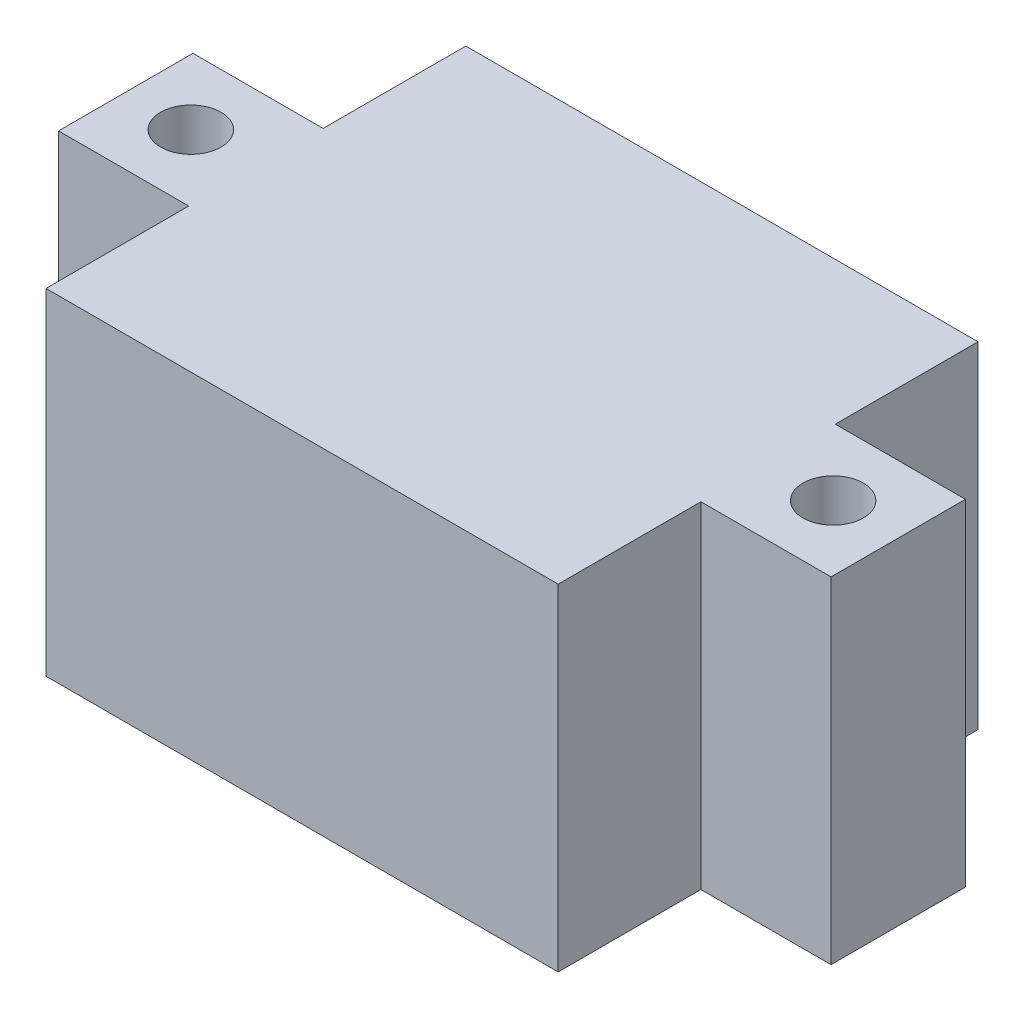
ISO-10303-21;
HEADER;
FILE_DESCRIPTION(('STEP AP214'),'2;1');
FILE_NAME('part.step','',(''),(''),'','','');
FILE_SCHEMA(('AUTOMOTIVE_DESIGN { 1 0 10303 214 1 1 1 1 }'));
ENDSEC;
DATA;
#1=APPLICATION_CONTEXT('core data for automotive mechanical design processes');
#2=APPLICATION_PROTOCOL_DEFINITION('international standard','automotive_design',2000,#1);
#3=PRODUCT_CONTEXT('',#1,'mechanical');
#4=PRODUCT('Part','Part','',(#3));
#5=PRODUCT_RELATED_PRODUCT_CATEGORY('part','',(#4));
#6=PRODUCT_DEFINITION_FORMATION('','',#4);
#7=PRODUCT_DEFINITION_CONTEXT('part definition',#1,'design');
#8=PRODUCT_DEFINITION('design','',#6,#7);
#9=PRODUCT_DEFINITION_SHAPE('','',#8);
#10=(LENGTH_UNIT() NAMED_UNIT(*) SI_UNIT(.MILLI.,.METRE.));
#11=(NAMED_UNIT(*) PLANE_ANGLE_UNIT() SI_UNIT($,.RADIAN.));
#12=(NAMED_UNIT(*) SI_UNIT($,.STERADIAN.) SOLID_ANGLE_UNIT());
#13=UNCERTAINTY_MEASURE_WITH_UNIT(LENGTH_MEASURE(1.E-05),#10,'distance_accuracy_value','');
#14=(GEOMETRIC_REPRESENTATION_CONTEXT(3) GLOBAL_UNCERTAINTY_ASSIGNED_CONTEXT((#13)) GLOBAL_UNIT_ASSIGNED_CONTEXT((#10,
#11,#12)) REPRESENTATION_CONTEXT('',''));
#15=CARTESIAN_POINT('',(0.,0.,0.));
#16=DIRECTION('',(0.,0.,1.));
#17=DIRECTION('',(1.,0.,0.));
#18=AXIS2_PLACEMENT_3D('',#15,#16,#17);
#19=CARTESIAN_POINT('',(-15.25,20.,-12.5));
#20=DIRECTION('',(1.,0.,0.));
#21=DIRECTION('',(0.,0.,-1.));
#22=AXIS2_PLACEMENT_3D('',#19,#20,#21);
#23=PLANE('',#22);
#24=DIRECTION('',(0.,0.,1.));
#25=VECTOR('',#24,1.);
#26=CARTESIAN_POINT('',(-15.25,0.,-12.5));
#27=LINE('',#26,#25);
#28=CARTESIAN_POINT('',(-15.25,0.,-12.5));
#29=VERTEX_POINT('',#28);
#30=CARTESIAN_POINT('',(-15.25,0.,-4.00134340890009));
#31=VERTEX_POINT('',#30);
#32=EDGE_CURVE('E163',#29,#31,#27,.T.);
#33=ORIENTED_EDGE('',*,*,#32,.T.);
#34=DIRECTION('',(0.,-1.,0.));
#35=VECTOR('',#34,1.);
#36=CARTESIAN_POINT('',(-15.25,20.,-4.00134340890009));
#37=LINE('',#36,#35);
#38=CARTESIAN_POINT('',(-15.25,20.,-4.00134340890009));
#39=VERTEX_POINT('',#38);
#40=EDGE_CURVE('E11',#39,#31,#37,.T.);
#41=ORIENTED_EDGE('',*,*,#40,.F.);
#42=DIRECTION('',(0.,0.,1.));
#43=VECTOR('',#42,1.);
#44=CARTESIAN_POINT('',(-15.25,20.,-12.5));
#45=LINE('',#44,#43);
#46=CARTESIAN_POINT('',(-15.25,20.,-12.5));
#47=VERTEX_POINT('',#46);
#48=EDGE_CURVE('E104',#47,#39,#45,.T.);
#49=ORIENTED_EDGE('',*,*,#48,.F.);
#50=DIRECTION('',(0.,-1.,0.));
#51=VECTOR('',#50,1.);
#52=CARTESIAN_POINT('',(-15.25,20.,-12.5));
#53=LINE('',#52,#51);
#54=EDGE_CURVE('E55',#47,#29,#53,.T.);
#55=ORIENTED_EDGE('',*,*,#54,.T.);
#56=EDGE_LOOP('',(#33,#41,#49,#55));
#57=FACE_BOUND('',#56,.T.);
#58=ADVANCED_FACE('F38',(#57),#23,.F.);
#59=CARTESIAN_POINT('',(-23.,20.,-4.00134340890009));
#60=DIRECTION('',(0.,0.,-1.));
#61=DIRECTION('',(-1.,0.,0.));
#62=AXIS2_PLACEMENT_3D('',#59,#60,#61);
#63=PLANE('',#62);
#64=DIRECTION('',(1.,0.,0.));
#65=VECTOR('',#64,1.);
#66=CARTESIAN_POINT('',(-23.,0.,-4.00134340890009));
#67=LINE('',#66,#65);
#68=CARTESIAN_POINT('',(-23.,0.,-4.00134340890009));
#69=VERTEX_POINT('',#68);
#70=EDGE_CURVE('E166',#69,#31,#67,.T.);
#71=ORIENTED_EDGE('',*,*,#70,.F.);
#72=DIRECTION('',(0.,-1.,0.));
#73=VECTOR('',#72,1.);
#74=CARTESIAN_POINT('',(-23.,20.,-4.00134340890009));
#75=LINE('',#74,#73);
#76=CARTESIAN_POINT('',(-23.,20.,-4.00134340890009));
#77=VERTEX_POINT('',#76);
#78=EDGE_CURVE('E47',#77,#69,#75,.T.);
#79=ORIENTED_EDGE('',*,*,#78,.F.);
#80=DIRECTION('',(1.,0.,0.));
#81=VECTOR('',#80,1.);
#82=CARTESIAN_POINT('',(-23.,20.,-4.00134340890009));
#83=LINE('',#82,#81);
#84=EDGE_CURVE('E256',#77,#39,#83,.T.);
#85=ORIENTED_EDGE('',*,*,#84,.T.);
#86=ORIENTED_EDGE('',*,*,#40,.T.);
#87=EDGE_LOOP('',(#71,#79,#85,#86));
#88=FACE_BOUND('',#87,.T.);
#89=ADVANCED_FACE('F240',(#88),#63,.T.);
#90=CARTESIAN_POINT('',(-23.,20.,4.00134340890011));
#91=DIRECTION('',(-1.,0.,0.));
#92=DIRECTION('',(0.,0.,1.));
#93=AXIS2_PLACEMENT_3D('',#90,#91,#92);
#94=PLANE('',#93);
#95=DIRECTION('',(0.,0.,-1.));
#96=VECTOR('',#95,1.);
#97=CARTESIAN_POINT('',(-23.,0.,4.00134340890011));
#98=LINE('',#97,#96);
#99=CARTESIAN_POINT('',(-23.,0.,4.00134340890011));
#100=VERTEX_POINT('',#99);
#101=EDGE_CURVE('E171',#100,#69,#98,.T.);
#102=ORIENTED_EDGE('',*,*,#101,.F.);
#103=DIRECTION('',(0.,-1.,0.));
#104=VECTOR('',#103,1.);
#105=CARTESIAN_POINT('',(-23.,20.,4.00134340890011));
#106=LINE('',#105,#104);
#107=CARTESIAN_POINT('',(-23.,20.,4.00134340890011));
#108=VERTEX_POINT('',#107);
#109=EDGE_CURVE('E228',#108,#100,#106,.T.);
#110=ORIENTED_EDGE('',*,*,#109,.F.);
#111=DIRECTION('',(0.,0.,-1.));
#112=VECTOR('',#111,1.);
#113=CARTESIAN_POINT('',(-23.,20.,4.00134340890011));
#114=LINE('',#113,#112);
#115=EDGE_CURVE('E237',#108,#77,#114,.T.);
#116=ORIENTED_EDGE('',*,*,#115,.T.);
#117=ORIENTED_EDGE('',*,*,#78,.T.);
#118=EDGE_LOOP('',(#102,#110,#116,#117));
#119=FACE_BOUND('',#118,.T.);
#120=ADVANCED_FACE('F235',(#119),#94,.T.);
#121=CARTESIAN_POINT('',(-23.,20.,4.00134340890011));
#122=DIRECTION('',(0.,0.,-1.));
#123=DIRECTION('',(-1.,0.,0.));
#124=AXIS2_PLACEMENT_3D('',#121,#122,#123);
#125=PLANE('',#124);
#126=DIRECTION('',(1.,0.,0.));
#127=VECTOR('',#126,1.);
#128=CARTESIAN_POINT('',(-23.,0.,4.00134340890011));
#129=LINE('',#128,#127);
#130=CARTESIAN_POINT('',(-15.25,0.,4.00134340890011));
#131=VERTEX_POINT('',#130);
#132=EDGE_CURVE('E175',#100,#131,#129,.T.);
#133=ORIENTED_EDGE('',*,*,#132,.T.);
#134=DIRECTION('',(0.,-1.,0.));
#135=VECTOR('',#134,1.);
#136=CARTESIAN_POINT('',(-15.25,20.,4.00134340890011));
#137=LINE('',#136,#135);
#138=CARTESIAN_POINT('',(-15.25,20.,4.00134340890011));
#139=VERTEX_POINT('',#138);
#140=EDGE_CURVE('E225',#139,#131,#137,.T.);
#141=ORIENTED_EDGE('',*,*,#140,.F.);
#142=DIRECTION('',(1.,0.,0.));
#143=VECTOR('',#142,1.);
#144=CARTESIAN_POINT('',(-23.,20.,4.00134340890011));
#145=LINE('',#144,#143);
#146=EDGE_CURVE('E251',#108,#139,#145,.T.);
#147=ORIENTED_EDGE('',*,*,#146,.F.);
#148=ORIENTED_EDGE('',*,*,#109,.T.);
#149=EDGE_LOOP('',(#133,#141,#147,#148));
#150=FACE_BOUND('',#149,.T.);
#151=ADVANCED_FACE('F248',(#150),#125,.F.);
#152=CARTESIAN_POINT('',(-15.25,20.,12.5));
#153=DIRECTION('',(-1.,0.,0.));
#154=DIRECTION('',(0.,0.,1.));
#155=AXIS2_PLACEMENT_3D('',#152,#153,#154);
#156=PLANE('',#155);
#157=DIRECTION('',(0.,0.,-1.));
#158=VECTOR('',#157,1.);
#159=CARTESIAN_POINT('',(-15.25,0.,12.5));
#160=LINE('',#159,#158);
#161=CARTESIAN_POINT('',(-15.25,0.,12.5));
#162=VERTEX_POINT('',#161);
#163=EDGE_CURVE('E179',#162,#131,#160,.T.);
#164=ORIENTED_EDGE('',*,*,#163,.F.);
#165=DIRECTION('',(0.,-1.,0.));
#166=VECTOR('',#165,1.);
#167=CARTESIAN_POINT('',(-15.25,20.,12.5));
#168=LINE('',#167,#166);
#169=CARTESIAN_POINT('',(-15.25,20.,12.5));
#170=VERTEX_POINT('',#169);
#171=EDGE_CURVE('E222',#170,#162,#168,.T.);
#172=ORIENTED_EDGE('',*,*,#171,.F.);
#173=DIRECTION('',(0.,0.,-1.));
#174=VECTOR('',#173,1.);
#175=CARTESIAN_POINT('',(-15.25,20.,12.5));
#176=LINE('',#175,#174);
#177=EDGE_CURVE('E254',#170,#139,#176,.T.);
#178=ORIENTED_EDGE('',*,*,#177,.T.);
#179=ORIENTED_EDGE('',*,*,#140,.T.);
#180=EDGE_LOOP('',(#164,#172,#178,#179));
#181=FACE_BOUND('',#180,.T.);
#182=ADVANCED_FACE('F405',(#181),#156,.T.);
#183=CARTESIAN_POINT('',(-15.25,20.,12.5));
#184=DIRECTION('',(0.,0.,-1.));
#185=DIRECTION('',(-1.,0.,0.));
#186=AXIS2_PLACEMENT_3D('',#183,#184,#185);
#187=PLANE('',#186);
#188=DIRECTION('',(1.,0.,0.));
#189=VECTOR('',#188,1.);
#190=CARTESIAN_POINT('',(-15.25,0.,12.5));
#191=LINE('',#190,#189);
#192=CARTESIAN_POINT('',(15.25,0.,12.5));
#193=VERTEX_POINT('',#192);
#194=EDGE_CURVE('E183',#162,#193,#191,.T.);
#195=ORIENTED_EDGE('',*,*,#194,.T.);
#196=DIRECTION('',(0.,-1.,0.));
#197=VECTOR('',#196,1.);
#198=CARTESIAN_POINT('',(15.25,20.,12.5));
#199=LINE('',#198,#197);
#200=CARTESIAN_POINT('',(15.25,20.,12.5));
#201=VERTEX_POINT('',#200);
#202=EDGE_CURVE('E218',#201,#193,#199,.T.);
#203=ORIENTED_EDGE('',*,*,#202,.F.);
#204=DIRECTION('',(1.,0.,0.));
#205=VECTOR('',#204,1.);
#206=CARTESIAN_POINT('',(-15.25,20.,12.5));
#207=LINE('',#206,#205);
#208=EDGE_CURVE('E265',#170,#201,#207,.T.);
#209=ORIENTED_EDGE('',*,*,#208,.F.);
#210=ORIENTED_EDGE('',*,*,#171,.T.);
#211=EDGE_LOOP('',(#195,#203,#209,#210));
#212=FACE_BOUND('',#211,.T.);
#213=ADVANCED_FACE('F396',(#212),#187,.F.);
#214=CARTESIAN_POINT('',(15.25,20.,12.5));
#215=DIRECTION('',(-1.,0.,0.));
#216=DIRECTION('',(0.,0.,1.));
#217=AXIS2_PLACEMENT_3D('',#214,#215,#216);
#218=PLANE('',#217);
#219=DIRECTION('',(0.,0.,-1.));
#220=VECTOR('',#219,1.);
#221=CARTESIAN_POINT('',(15.25,0.,12.5));
#222=LINE('',#221,#220);
#223=CARTESIAN_POINT('',(15.25,0.,4.0013434089001));
#224=VERTEX_POINT('',#223);
#225=EDGE_CURVE('E186',#193,#224,#222,.T.);
#226=ORIENTED_EDGE('',*,*,#225,.T.);
#227=DIRECTION('',(0.,-1.,0.));
#228=VECTOR('',#227,1.);
#229=CARTESIAN_POINT('',(15.25,20.,4.0013434089001));
#230=LINE('',#229,#228);
#231=CARTESIAN_POINT('',(15.25,20.,4.0013434089001));
#232=VERTEX_POINT('',#231);
#233=EDGE_CURVE('E215',#232,#224,#230,.T.);
#234=ORIENTED_EDGE('',*,*,#233,.F.);
#235=DIRECTION('',(0.,0.,-1.));
#236=VECTOR('',#235,1.);
#237=CARTESIAN_POINT('',(15.25,20.,12.5));
#238=LINE('',#237,#236);
#239=EDGE_CURVE('E268',#201,#232,#238,.T.);
#240=ORIENTED_EDGE('',*,*,#239,.F.);
#241=ORIENTED_EDGE('',*,*,#202,.T.);
#242=EDGE_LOOP('',(#226,#234,#240,#241));
#243=FACE_BOUND('',#242,.T.);
#244=ADVANCED_FACE('F283',(#243),#218,.F.);
#245=CARTESIAN_POINT('',(23.,20.,4.0013434089001));
#246=DIRECTION('',(0.,0.,1.));
#247=DIRECTION('',(1.,0.,0.));
#248=AXIS2_PLACEMENT_3D('',#245,#246,#247);
#249=PLANE('',#248);
#250=DIRECTION('',(-1.,0.,0.));
#251=VECTOR('',#250,1.);
#252=CARTESIAN_POINT('',(23.,0.,4.0013434089001));
#253=LINE('',#252,#251);
#254=CARTESIAN_POINT('',(23.,0.,4.0013434089001));
#255=VERTEX_POINT('',#254);
#256=EDGE_CURVE('E190',#255,#224,#253,.T.);
#257=ORIENTED_EDGE('',*,*,#256,.F.);
#258=DIRECTION('',(0.,-1.,0.));
#259=VECTOR('',#258,1.);
#260=CARTESIAN_POINT('',(23.,20.,4.0013434089001));
#261=LINE('',#260,#259);
#262=CARTESIAN_POINT('',(23.,20.,4.0013434089001));
#263=VERTEX_POINT('',#262);
#264=EDGE_CURVE('E212',#263,#255,#261,.T.);
#265=ORIENTED_EDGE('',*,*,#264,.F.);
#266=DIRECTION('',(-1.,0.,0.));
#267=VECTOR('',#266,1.);
#268=CARTESIAN_POINT('',(23.,20.,4.0013434089001));
#269=LINE('',#268,#267);
#270=EDGE_CURVE('E271',#263,#232,#269,.T.);
#271=ORIENTED_EDGE('',*,*,#270,.T.);
#272=ORIENTED_EDGE('',*,*,#233,.T.);
#273=EDGE_LOOP('',(#257,#265,#271,#272));
#274=FACE_BOUND('',#273,.T.);
#275=ADVANCED_FACE('F277',(#274),#249,.T.);
#276=CARTESIAN_POINT('',(23.,20.,4.0013434089001));
#277=DIRECTION('',(-1.,0.,0.));
#278=DIRECTION('',(0.,0.,1.));
#279=AXIS2_PLACEMENT_3D('',#276,#277,#278);
#280=PLANE('',#279);
#281=DIRECTION('',(0.,0.,-1.));
#282=VECTOR('',#281,1.);
#283=CARTESIAN_POINT('',(23.,0.,4.0013434089001));
#284=LINE('',#283,#282);
#285=CARTESIAN_POINT('',(23.,0.,-4.0013434089001));
#286=VERTEX_POINT('',#285);
#287=EDGE_CURVE('E194',#255,#286,#284,.T.);
#288=ORIENTED_EDGE('',*,*,#287,.T.);
#289=DIRECTION('',(0.,-1.,0.));
#290=VECTOR('',#289,1.);
#291=CARTESIAN_POINT('',(23.,20.,-4.0013434089001));
#292=LINE('',#291,#290);
#293=CARTESIAN_POINT('',(23.,20.,-4.0013434089001));
#294=VERTEX_POINT('',#293);
#295=EDGE_CURVE('E153',#294,#286,#292,.T.);
#296=ORIENTED_EDGE('',*,*,#295,.F.);
#297=DIRECTION('',(0.,0.,-1.));
#298=VECTOR('',#297,1.);
#299=CARTESIAN_POINT('',(23.,20.,4.0013434089001));
#300=LINE('',#299,#298);
#301=EDGE_CURVE('E139',#263,#294,#300,.T.);
#302=ORIENTED_EDGE('',*,*,#301,.F.);
#303=ORIENTED_EDGE('',*,*,#264,.T.);
#304=EDGE_LOOP('',(#288,#296,#302,#303));
#305=FACE_BOUND('',#304,.T.);
#306=ADVANCED_FACE('F287',(#305),#280,.F.);
#307=CARTESIAN_POINT('',(23.,20.,-4.0013434089001));
#308=DIRECTION('',(0.,0.,1.));
#309=DIRECTION('',(1.,0.,0.));
#310=AXIS2_PLACEMENT_3D('',#307,#308,#309);
#311=PLANE('',#310);
#312=DIRECTION('',(-1.,0.,0.));
#313=VECTOR('',#312,1.);
#314=CARTESIAN_POINT('',(23.,0.,-4.0013434089001));
#315=LINE('',#314,#313);
#316=CARTESIAN_POINT('',(15.25,0.,-4.0013434089001));
#317=VERTEX_POINT('',#316);
#318=EDGE_CURVE('E149',#286,#317,#315,.T.);
#319=ORIENTED_EDGE('',*,*,#318,.T.);
#320=DIRECTION('',(0.,-1.,0.));
#321=VECTOR('',#320,1.);
#322=CARTESIAN_POINT('',(15.25,20.,-4.0013434089001));
#323=LINE('',#322,#321);
#324=CARTESIAN_POINT('',(15.25,20.,-4.0013434089001));
#325=VERTEX_POINT('',#324);
#326=EDGE_CURVE('E146',#325,#317,#323,.T.);
#327=ORIENTED_EDGE('',*,*,#326,.F.);
#328=DIRECTION('',(-1.,0.,0.));
#329=VECTOR('',#328,1.);
#330=CARTESIAN_POINT('',(23.,20.,-4.0013434089001));
#331=LINE('',#330,#329);
#332=EDGE_CURVE('E132',#294,#325,#331,.T.);
#333=ORIENTED_EDGE('',*,*,#332,.F.);
#334=ORIENTED_EDGE('',*,*,#295,.T.);
#335=EDGE_LOOP('',(#319,#327,#333,#334));
#336=FACE_BOUND('',#335,.T.);
#337=ADVANCED_FACE('F147',(#336),#311,.F.);
#338=CARTESIAN_POINT('',(15.25,20.,-12.5));
#339=DIRECTION('',(1.,0.,0.));
#340=DIRECTION('',(0.,0.,-1.));
#341=AXIS2_PLACEMENT_3D('',#338,#339,#340);
#342=PLANE('',#341);
#343=DIRECTION('',(0.,0.,1.));
#344=VECTOR('',#343,1.);
#345=CARTESIAN_POINT('',(15.25,0.,-12.5));
#346=LINE('',#345,#344);
#347=CARTESIAN_POINT('',(15.25,0.,-12.5));
#348=VERTEX_POINT('',#347);
#349=EDGE_CURVE('E199',#348,#317,#346,.T.);
#350=ORIENTED_EDGE('',*,*,#349,.F.);
#351=DIRECTION('',(0.,-1.,0.));
#352=VECTOR('',#351,1.);
#353=CARTESIAN_POINT('',(15.25,20.,-12.5));
#354=LINE('',#353,#352);
#355=CARTESIAN_POINT('',(15.25,20.,-12.5));
#356=VERTEX_POINT('',#355);
#357=EDGE_CURVE('E92',#356,#348,#354,.T.);
#358=ORIENTED_EDGE('',*,*,#357,.F.);
#359=DIRECTION('',(0.,0.,1.));
#360=VECTOR('',#359,1.);
#361=CARTESIAN_POINT('',(15.25,20.,-12.5));
#362=LINE('',#361,#360);
#363=EDGE_CURVE('E136',#356,#325,#362,.T.);
#364=ORIENTED_EDGE('',*,*,#363,.T.);
#365=ORIENTED_EDGE('',*,*,#326,.T.);
#366=EDGE_LOOP('',(#350,#358,#364,#365));
#367=FACE_BOUND('',#366,.T.);
#368=ADVANCED_FACE('F155',(#367),#342,.T.);
#369=CARTESIAN_POINT('',(-15.25,20.,-12.5));
#370=DIRECTION('',(0.,0.,-1.));
#371=DIRECTION('',(-1.,0.,0.));
#372=AXIS2_PLACEMENT_3D('',#369,#370,#371);
#373=PLANE('',#372);
#374=DIRECTION('',(1.,0.,0.));
#375=VECTOR('',#374,1.);
#376=CARTESIAN_POINT('',(-15.25,0.,-12.5));
#377=LINE('',#376,#375);
#378=EDGE_CURVE('E202',#29,#348,#377,.T.);
#379=ORIENTED_EDGE('',*,*,#378,.F.);
#380=ORIENTED_EDGE('',*,*,#54,.F.);
#381=DIRECTION('',(1.,0.,0.));
#382=VECTOR('',#381,1.);
#383=CARTESIAN_POINT('',(-15.25,20.,-12.5));
#384=LINE('',#383,#382);
#385=EDGE_CURVE('E157',#47,#356,#384,.T.);
#386=ORIENTED_EDGE('',*,*,#385,.T.);
#387=ORIENTED_EDGE('',*,*,#357,.T.);
#388=EDGE_LOOP('',(#379,#380,#386,#387));
#389=FACE_BOUND('',#388,.T.);
#390=ADVANCED_FACE('F300',(#389),#373,.T.);
#391=CARTESIAN_POINT('',(0.,20.,0.));
#392=DIRECTION('',(0.,1.,0.));
#393=DIRECTION('',(0.,0.,1.));
#394=AXIS2_PLACEMENT_3D('',#391,#392,#393);
#395=PLANE('',#394);
#396=CARTESIAN_POINT('',(-19.125,20.,0.));
#397=DIRECTION('',(0.,1.,0.));
#398=DIRECTION('',(0.,0.,1.));
#399=AXIS2_PLACEMENT_3D('',#396,#397,#398);
#400=CIRCLE('',#399,1.79999999999999);
#401=CARTESIAN_POINT('',(-19.125,20.,1.79999999999999));
#402=VERTEX_POINT('',#401);
#403=EDGE_CURVE('E330',#402,#402,#400,.T.);
#404=ORIENTED_EDGE('',*,*,#403,.F.);
#405=EDGE_LOOP('',(#404));
#406=FACE_BOUND('',#405,.T.);
#407=CARTESIAN_POINT('',(19.125,20.,0.));
#408=DIRECTION('',(0.,1.,0.));
#409=DIRECTION('',(0.,0.,1.));
#410=AXIS2_PLACEMENT_3D('',#407,#408,#409);
#411=CIRCLE('',#410,1.79999999999999);
#412=CARTESIAN_POINT('',(19.125,20.,1.79999999999999));
#413=VERTEX_POINT('',#412);
#414=EDGE_CURVE('E334',#413,#413,#411,.T.);
#415=ORIENTED_EDGE('',*,*,#414,.F.);
#416=EDGE_LOOP('',(#415));
#417=FACE_BOUND('',#416,.T.);
#418=ORIENTED_EDGE('',*,*,#48,.T.);
#419=ORIENTED_EDGE('',*,*,#84,.F.);
#420=ORIENTED_EDGE('',*,*,#115,.F.);
#421=ORIENTED_EDGE('',*,*,#146,.T.);
#422=ORIENTED_EDGE('',*,*,#177,.F.);
#423=ORIENTED_EDGE('',*,*,#208,.T.);
#424=ORIENTED_EDGE('',*,*,#239,.T.);
#425=ORIENTED_EDGE('',*,*,#270,.F.);
#426=ORIENTED_EDGE('',*,*,#301,.T.);
#427=ORIENTED_EDGE('',*,*,#332,.T.);
#428=ORIENTED_EDGE('',*,*,#363,.F.);
#429=ORIENTED_EDGE('',*,*,#385,.F.);
#430=EDGE_LOOP('',(#418,#419,#420,#421,#422,#423,#424,#425,#426,#427,#428,#429));
#431=FACE_BOUND('',#430,.T.);
#432=ADVANCED_FACE('F134',(#406,#417,#431),#395,.T.);
#433=CARTESIAN_POINT('',(0.,0.,0.));
#434=DIRECTION('',(0.,1.,0.));
#435=DIRECTION('',(0.,0.,1.));
#436=AXIS2_PLACEMENT_3D('',#433,#434,#435);
#437=PLANE('',#436);
#438=CARTESIAN_POINT('',(-19.125,0.,0.));
#439=DIRECTION('',(0.,1.,0.));
#440=DIRECTION('',(0.,0.,1.));
#441=AXIS2_PLACEMENT_3D('',#438,#439,#440);
#442=CIRCLE('',#441,1.8);
#443=CARTESIAN_POINT('',(-19.125,0.,1.8));
#444=VERTEX_POINT('',#443);
#445=EDGE_CURVE('E327',#444,#444,#442,.T.);
#446=ORIENTED_EDGE('',*,*,#445,.T.);
#447=EDGE_LOOP('',(#446));
#448=FACE_BOUND('',#447,.T.);
#449=CARTESIAN_POINT('',(19.125,0.,0.));
#450=DIRECTION('',(0.,1.,0.));
#451=DIRECTION('',(0.,0.,1.));
#452=AXIS2_PLACEMENT_3D('',#449,#450,#451);
#453=CIRCLE('',#452,1.8);
#454=CARTESIAN_POINT('',(19.125,0.,1.8));
#455=VERTEX_POINT('',#454);
#456=EDGE_CURVE('E167',#455,#455,#453,.T.);
#457=ORIENTED_EDGE('',*,*,#456,.T.);
#458=EDGE_LOOP('',(#457));
#459=FACE_BOUND('',#458,.T.);
#460=ORIENTED_EDGE('',*,*,#32,.F.);
#461=ORIENTED_EDGE('',*,*,#378,.T.);
#462=ORIENTED_EDGE('',*,*,#349,.T.);
#463=ORIENTED_EDGE('',*,*,#318,.F.);
#464=ORIENTED_EDGE('',*,*,#287,.F.);
#465=ORIENTED_EDGE('',*,*,#256,.T.);
#466=ORIENTED_EDGE('',*,*,#225,.F.);
#467=ORIENTED_EDGE('',*,*,#194,.F.);
#468=ORIENTED_EDGE('',*,*,#163,.T.);
#469=ORIENTED_EDGE('',*,*,#132,.F.);
#470=ORIENTED_EDGE('',*,*,#101,.T.);
#471=ORIENTED_EDGE('',*,*,#70,.T.);
#472=EDGE_LOOP('',(#460,#461,#462,#463,#464,#465,#466,#467,#468,#469,#470,#471));
#473=FACE_BOUND('',#472,.T.);
#474=ADVANCED_FACE('F243',(#448,#459,#473),#437,.F.);
#475=CARTESIAN_POINT('',(19.125,20.,0.));
#476=DIRECTION('',(0.,1.,0.));
#477=DIRECTION('',(0.,0.,1.));
#478=AXIS2_PLACEMENT_3D('',#475,#476,#477);
#479=CYLINDRICAL_SURFACE('',#478,1.79999999999999);
#480=ORIENTED_EDGE('',*,*,#456,.F.);
#481=EDGE_LOOP('',(#480));
#482=FACE_BOUND('',#481,.T.);
#483=ORIENTED_EDGE('',*,*,#414,.T.);
#484=EDGE_LOOP('',(#483));
#485=FACE_BOUND('',#484,.T.);
#486=ADVANCED_FACE('F313',(#482,#485),#479,.F.);
#487=CARTESIAN_POINT('',(-19.125,20.,0.));
#488=DIRECTION('',(0.,1.,0.));
#489=DIRECTION('',(0.,0.,1.));
#490=AXIS2_PLACEMENT_3D('',#487,#488,#489);
#491=CYLINDRICAL_SURFACE('',#490,1.79999999999999);
#492=ORIENTED_EDGE('',*,*,#445,.F.);
#493=EDGE_LOOP('',(#492));
#494=FACE_BOUND('',#493,.T.);
#495=ORIENTED_EDGE('',*,*,#403,.T.);
#496=EDGE_LOOP('',(#495));
#497=FACE_BOUND('',#496,.T.);
#498=ADVANCED_FACE('F318',(#494,#497),#491,.F.);
#499=CLOSED_SHELL('',(#58,#89,#120,#151,#182,#213,#244,#275,#306,#337,#368,#390,#432,#474,#486,#498));
#500=MANIFOLD_SOLID_BREP('B2',#499);
#501=ADVANCED_BREP_SHAPE_REPRESENTATION('',(#18,#500),#14);
#502=SHAPE_DEFINITION_REPRESENTATION(#9,#501);
ENDSEC;
END-ISO-10303-21;
